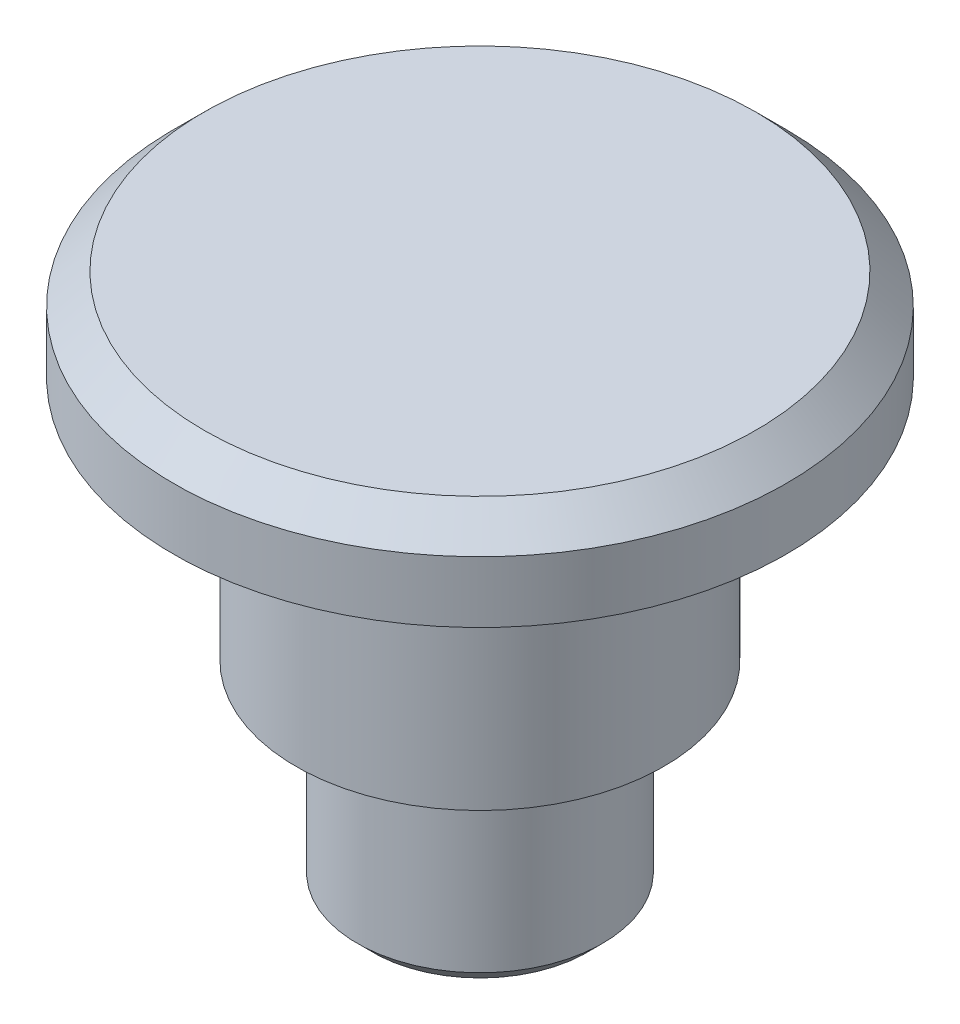
ISO-10303-21;
HEADER;
FILE_DESCRIPTION(('STEP AP214'),'2;1');
FILE_NAME('part.step','',(''),(''),'','','');
FILE_SCHEMA(('AUTOMOTIVE_DESIGN { 1 0 10303 214 1 1 1 1 }'));
ENDSEC;
DATA;
#1=APPLICATION_CONTEXT('core data for automotive mechanical design processes');
#2=APPLICATION_PROTOCOL_DEFINITION('international standard','automotive_design',2000,#1);
#3=PRODUCT_CONTEXT('',#1,'mechanical');
#4=PRODUCT('Part','Part','',(#3));
#5=PRODUCT_RELATED_PRODUCT_CATEGORY('part','',(#4));
#6=PRODUCT_DEFINITION_FORMATION('','',#4);
#7=PRODUCT_DEFINITION_CONTEXT('part definition',#1,'design');
#8=PRODUCT_DEFINITION('design','',#6,#7);
#9=PRODUCT_DEFINITION_SHAPE('','',#8);
#10=(LENGTH_UNIT() NAMED_UNIT(*) SI_UNIT(.MILLI.,.METRE.));
#11=(NAMED_UNIT(*) PLANE_ANGLE_UNIT() SI_UNIT($,.RADIAN.));
#12=(NAMED_UNIT(*) SI_UNIT($,.STERADIAN.) SOLID_ANGLE_UNIT());
#13=UNCERTAINTY_MEASURE_WITH_UNIT(LENGTH_MEASURE(1.E-05),#10,'distance_accuracy_value','');
#14=(GEOMETRIC_REPRESENTATION_CONTEXT(3) GLOBAL_UNCERTAINTY_ASSIGNED_CONTEXT((#13)) GLOBAL_UNIT_ASSIGNED_CONTEXT((#10,
#11,#12)) REPRESENTATION_CONTEXT('',''));
#15=CARTESIAN_POINT('',(0.,0.,0.));
#16=DIRECTION('',(0.,0.,1.));
#17=DIRECTION('',(1.,0.,0.));
#18=AXIS2_PLACEMENT_3D('',#15,#16,#17);
#19=CARTESIAN_POINT('',(-1.11022302462516E-13,0.,0.));
#20=DIRECTION('',(0.,-1.,0.));
#21=DIRECTION('',(0.,0.,-1.));
#22=AXIS2_PLACEMENT_3D('',#19,#20,#21);
#23=PLANE('',#22);
#24=CARTESIAN_POINT('',(-1.11022302462516E-13,0.,0.));
#25=DIRECTION('',(0.,-1.,0.));
#26=DIRECTION('',(0.,0.,-1.));
#27=AXIS2_PLACEMENT_3D('',#24,#25,#26);
#28=CIRCLE('',#27,3.50000000000001);
#29=CARTESIAN_POINT('',(-1.05970787700471E-13,0.,-3.50000000000002));
#30=VERTEX_POINT('',#29);
#31=EDGE_CURVE('E10',#30,#30,#28,.T.);
#32=ORIENTED_EDGE('',*,*,#31,.T.);
#33=EDGE_LOOP('',(#32));
#34=FACE_BOUND('',#33,.T.);
#35=ADVANCED_FACE('F35',(#34),#23,.T.);
#36=CARTESIAN_POINT('',(-1.11022302462516E-13,0.,0.));
#37=DIRECTION('',(0.,1.,0.));
#38=DIRECTION('',(0.,0.,1.));
#39=AXIS2_PLACEMENT_3D('',#36,#37,#38);
#40=CONICAL_SURFACE('',#39,3.50000000000001,0.785398163397448);
#41=CARTESIAN_POINT('',(-1.99840144432528E-12,0.500000000000556,8.88178419700125E-13));
#42=DIRECTION('',(0.,-1.,0.));
#43=DIRECTION('',(0.,0.,-1.));
#44=AXIS2_PLACEMENT_3D('',#41,#42,#43);
#45=CIRCLE('',#44,4.00000000000001);
#46=CARTESIAN_POINT('',(-1.99262828459723E-12,0.500000000000556,-3.99999999999913));
#47=VERTEX_POINT('',#46);
#48=EDGE_CURVE('E41',#47,#47,#45,.T.);
#49=ORIENTED_EDGE('',*,*,#48,.T.);
#50=EDGE_LOOP('',(#49));
#51=FACE_BOUND('',#50,.T.);
#52=ORIENTED_EDGE('',*,*,#31,.F.);
#53=EDGE_LOOP('',(#52));
#54=FACE_BOUND('',#53,.T.);
#55=ADVANCED_FACE('F87',(#51,#54),#40,.T.);
#56=CARTESIAN_POINT('',(-1.11022302462516E-13,0.,0.));
#57=DIRECTION('',(0.,-1.,0.));
#58=DIRECTION('',(0.,0.,-1.));
#59=AXIS2_PLACEMENT_3D('',#56,#57,#58);
#60=CYLINDRICAL_SURFACE('',#59,4.00000000000001);
#61=CARTESIAN_POINT('',(-8.88178419700125E-13,6.50000000000056,6.66133814775094E-13));
#62=DIRECTION('',(0.,-1.,0.));
#63=DIRECTION('',(0.,0.,-1.));
#64=AXIS2_PLACEMENT_3D('',#61,#62,#63);
#65=CIRCLE('',#64,4.00000000000001);
#66=CARTESIAN_POINT('',(-8.82405259972074E-13,6.50000000000056,-3.99999999999935));
#67=VERTEX_POINT('',#66);
#68=EDGE_CURVE('E45',#67,#67,#65,.T.);
#69=ORIENTED_EDGE('',*,*,#68,.T.);
#70=EDGE_LOOP('',(#69));
#71=FACE_BOUND('',#70,.T.);
#72=ORIENTED_EDGE('',*,*,#48,.F.);
#73=EDGE_LOOP('',(#72));
#74=FACE_BOUND('',#73,.T.);
#75=ADVANCED_FACE('F91',(#71,#74),#60,.T.);
#76=CARTESIAN_POINT('',(-8.88178419700125E-13,6.50000000000056,6.66133814775094E-13));
#77=DIRECTION('',(0.,-1.,0.));
#78=DIRECTION('',(0.,0.,-1.));
#79=AXIS2_PLACEMENT_3D('',#76,#77,#78);
#80=TOROIDAL_SURFACE('',#79,4.30000000000001,0.3);
#81=CARTESIAN_POINT('',(-8.88178419700125E-13,6.50000000000056,6.66133814775094E-13));
#82=DIRECTION('',(0.,-1.,0.));
#83=DIRECTION('',(0.,0.,-1.));
#84=AXIS2_PLACEMENT_3D('',#81,#82,#83);
#85=CIRCLE('',#84,4.60000000000001);
#86=CARTESIAN_POINT('',(-8.81539286012867E-13,6.50000000000056,-4.59999999999935));
#87=VERTEX_POINT('',#86);
#88=EDGE_CURVE('E49',#87,#87,#85,.T.);
#89=ORIENTED_EDGE('',*,*,#88,.T.);
#90=EDGE_LOOP('',(#89));
#91=FACE_BOUND('',#90,.T.);
#92=ORIENTED_EDGE('',*,*,#68,.F.);
#93=EDGE_LOOP('',(#92));
#94=FACE_BOUND('',#93,.T.);
#95=ADVANCED_FACE('F95',(#91,#94),#80,.F.);
#96=CARTESIAN_POINT('',(5.99999999999989,6.50000000000056,2.22044604925031E-12));
#97=DIRECTION('',(0.,-1.,0.));
#98=DIRECTION('',(0.,0.,-1.));
#99=AXIS2_PLACEMENT_3D('',#96,#97,#98);
#100=PLANE('',#99);
#101=CARTESIAN_POINT('',(-8.88178419700125E-13,6.50000000000056,6.66133814775094E-13));
#102=DIRECTION('',(0.,-1.,0.));
#103=DIRECTION('',(0.,0.,-1.));
#104=AXIS2_PLACEMENT_3D('',#101,#102,#103);
#105=CIRCLE('',#104,6.00000000000001);
#106=CARTESIAN_POINT('',(-8.79518680108049E-13,6.50000000000056,-5.99999999999935));
#107=VERTEX_POINT('',#106);
#108=EDGE_CURVE('E54',#107,#107,#105,.T.);
#109=ORIENTED_EDGE('',*,*,#108,.T.);
#110=EDGE_LOOP('',(#109));
#111=FACE_BOUND('',#110,.T.);
#112=ORIENTED_EDGE('',*,*,#88,.F.);
#113=EDGE_LOOP('',(#112));
#114=FACE_BOUND('',#113,.T.);
#115=ADVANCED_FACE('F102',(#111,#114),#100,.T.);
#116=CARTESIAN_POINT('',(-1.11022302462516E-13,0.,0.));
#117=DIRECTION('',(0.,-1.,0.));
#118=DIRECTION('',(0.,0.,-1.));
#119=AXIS2_PLACEMENT_3D('',#116,#117,#118);
#120=CYLINDRICAL_SURFACE('',#119,6.00000000000001);
#121=CARTESIAN_POINT('',(0.,14.5,2.22044604925031E-13));
#122=DIRECTION('',(0.,-1.,0.));
#123=DIRECTION('',(0.,0.,-1.));
#124=AXIS2_PLACEMENT_3D('',#121,#122,#123);
#125=CIRCLE('',#124,6.00000000000001);
#126=CARTESIAN_POINT('',(0.,14.5,-5.9999999999998));
#127=VERTEX_POINT('',#126);
#128=EDGE_CURVE('E57',#127,#127,#125,.T.);
#129=ORIENTED_EDGE('',*,*,#128,.T.);
#130=EDGE_LOOP('',(#129));
#131=FACE_BOUND('',#130,.T.);
#132=ORIENTED_EDGE('',*,*,#108,.F.);
#133=EDGE_LOOP('',(#132));
#134=FACE_BOUND('',#133,.T.);
#135=ADVANCED_FACE('F106',(#131,#134),#120,.T.);
#136=CARTESIAN_POINT('',(0.,14.5,2.22044604925031E-13));
#137=DIRECTION('',(0.,-1.,0.));
#138=DIRECTION('',(0.,0.,-1.));
#139=AXIS2_PLACEMENT_3D('',#136,#137,#138);
#140=TOROIDAL_SURFACE('',#139,6.30000000000001,0.3);
#141=CARTESIAN_POINT('',(0.,14.5,2.22044604925031E-13));
#142=DIRECTION('',(0.,-1.,0.));
#143=DIRECTION('',(0.,0.,-1.));
#144=AXIS2_PLACEMENT_3D('',#141,#142,#143);
#145=CIRCLE('',#144,6.60000000000001);
#146=CARTESIAN_POINT('',(0.,14.5,-6.5999999999998));
#147=VERTEX_POINT('',#146);
#148=EDGE_CURVE('E60',#147,#147,#145,.T.);
#149=ORIENTED_EDGE('',*,*,#148,.T.);
#150=EDGE_LOOP('',(#149));
#151=FACE_BOUND('',#150,.T.);
#152=ORIENTED_EDGE('',*,*,#128,.F.);
#153=EDGE_LOOP('',(#152));
#154=FACE_BOUND('',#153,.T.);
#155=ADVANCED_FACE('F110',(#151,#154),#140,.F.);
#156=CARTESIAN_POINT('',(6.59999999999983,14.5000000000006,2.22044604925031E-13));
#157=DIRECTION('',(0.,-1.,0.));
#158=DIRECTION('',(0.,0.,-1.));
#159=AXIS2_PLACEMENT_3D('',#156,#157,#158);
#160=PLANE('',#159);
#161=CARTESIAN_POINT('',(0.,14.5,2.22044604925031E-13));
#162=DIRECTION('',(0.,-1.,0.));
#163=DIRECTION('',(0.,0.,-1.));
#164=AXIS2_PLACEMENT_3D('',#161,#162,#163);
#165=CIRCLE('',#164,10.);
#166=CARTESIAN_POINT('',(0.,14.5,-9.9999999999998));
#167=VERTEX_POINT('',#166);
#168=EDGE_CURVE('E63',#167,#167,#165,.T.);
#169=ORIENTED_EDGE('',*,*,#168,.T.);
#170=EDGE_LOOP('',(#169));
#171=FACE_BOUND('',#170,.T.);
#172=ORIENTED_EDGE('',*,*,#148,.F.);
#173=EDGE_LOOP('',(#172));
#174=FACE_BOUND('',#173,.T.);
#175=ADVANCED_FACE('F114',(#171,#174),#160,.T.);
#176=CARTESIAN_POINT('',(-1.11022302462516E-13,0.,0.));
#177=DIRECTION('',(0.,-1.,0.));
#178=DIRECTION('',(0.,0.,-1.));
#179=AXIS2_PLACEMENT_3D('',#176,#177,#178);
#180=CYLINDRICAL_SURFACE('',#179,10.);
#181=CARTESIAN_POINT('',(0.,16.5000000000006,0.));
#182=DIRECTION('',(0.,-1.,0.));
#183=DIRECTION('',(0.,0.,-1.));
#184=AXIS2_PLACEMENT_3D('',#181,#182,#183);
#185=CIRCLE('',#184,10.);
#186=CARTESIAN_POINT('',(0.,16.5000000000006,-10.));
#187=VERTEX_POINT('',#186);
#188=EDGE_CURVE('E66',#187,#187,#185,.T.);
#189=ORIENTED_EDGE('',*,*,#188,.T.);
#190=EDGE_LOOP('',(#189));
#191=FACE_BOUND('',#190,.T.);
#192=ORIENTED_EDGE('',*,*,#168,.F.);
#193=EDGE_LOOP('',(#192));
#194=FACE_BOUND('',#193,.T.);
#195=ADVANCED_FACE('F84',(#191,#194),#180,.T.);
#196=CARTESIAN_POINT('',(0.,16.5000000000006,0.));
#197=DIRECTION('',(0.,-1.,0.));
#198=DIRECTION('',(0.,0.,-1.));
#199=AXIS2_PLACEMENT_3D('',#196,#197,#198);
#200=CONICAL_SURFACE('',#199,10.,0.785398163397446);
#201=CARTESIAN_POINT('',(1.11022302462516E-13,17.5000000000011,2.22044604925031E-13));
#202=DIRECTION('',(0.,-1.,0.));
#203=DIRECTION('',(0.,0.,-1.));
#204=AXIS2_PLACEMENT_3D('',#201,#202,#203);
#205=CIRCLE('',#204,9.00000000000001);
#206=CARTESIAN_POINT('',(1.2401191185063E-13,17.5000000000011,-8.99999999999981));
#207=VERTEX_POINT('',#206);
#208=EDGE_CURVE('E69',#207,#207,#205,.T.);
#209=ORIENTED_EDGE('',*,*,#208,.T.);
#210=EDGE_LOOP('',(#209));
#211=FACE_BOUND('',#210,.T.);
#212=ORIENTED_EDGE('',*,*,#188,.F.);
#213=EDGE_LOOP('',(#212));
#214=FACE_BOUND('',#213,.T.);
#215=ADVANCED_FACE('F75',(#211,#214),#200,.T.);
#216=CARTESIAN_POINT('',(8.99999999999945,17.5000000000005,2.22044604925031E-13));
#217=DIRECTION('',(0.,1.,0.));
#218=DIRECTION('',(0.,0.,1.));
#219=AXIS2_PLACEMENT_3D('',#216,#217,#218);
#220=PLANE('',#219);
#221=ORIENTED_EDGE('',*,*,#208,.F.);
#222=EDGE_LOOP('',(#221));
#223=FACE_BOUND('',#222,.T.);
#224=ADVANCED_FACE('F78',(#223),#220,.T.);
#225=CLOSED_SHELL('',(#35,#55,#75,#95,#115,#135,#155,#175,#195,#215,#224));
#226=MANIFOLD_SOLID_BREP('B2',#225);
#227=ADVANCED_BREP_SHAPE_REPRESENTATION('',(#18,#226),#14);
#228=SHAPE_DEFINITION_REPRESENTATION(#9,#227);
ENDSEC;
END-ISO-10303-21;
